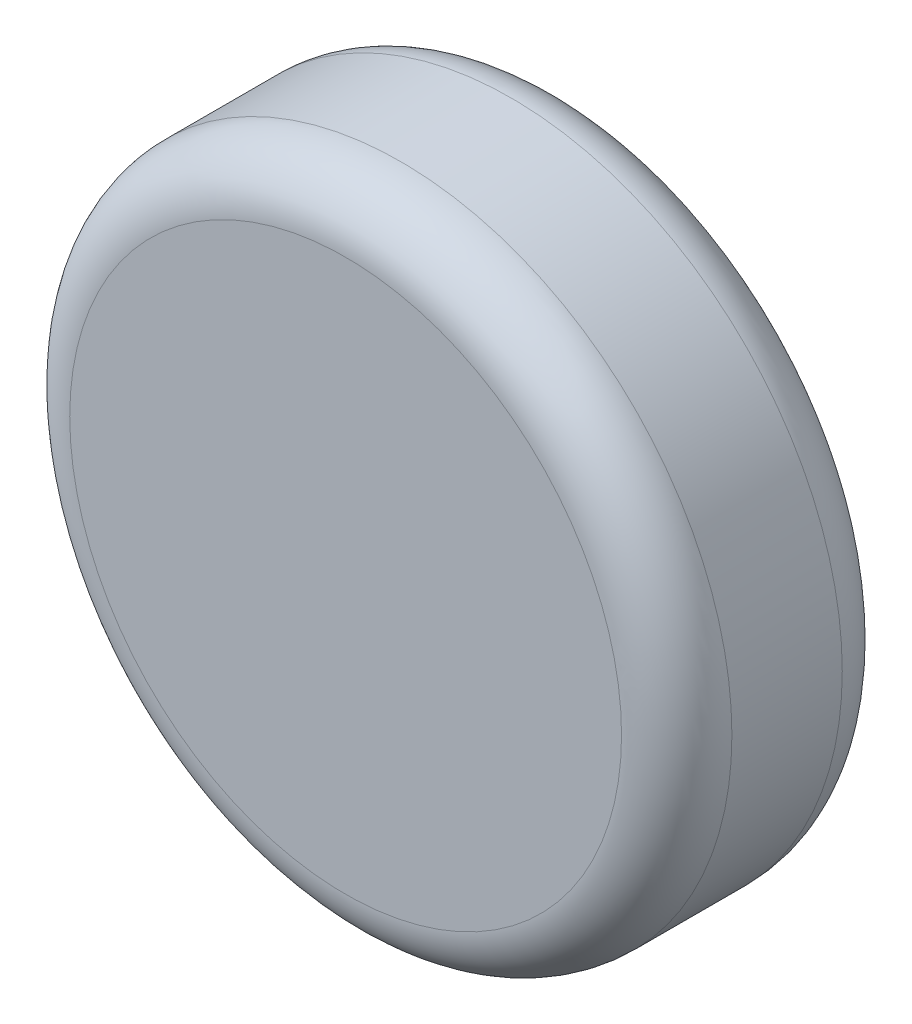
ISO-10303-21;
HEADER;
FILE_DESCRIPTION(('STEP AP214'),'2;1');
FILE_NAME('part.step','',(''),(''),'','','');
FILE_SCHEMA(('AUTOMOTIVE_DESIGN { 1 0 10303 214 1 1 1 1 }'));
ENDSEC;
DATA;
#1=APPLICATION_CONTEXT('core data for automotive mechanical design processes');
#2=APPLICATION_PROTOCOL_DEFINITION('international standard','automotive_design',2000,#1);
#3=PRODUCT_CONTEXT('',#1,'mechanical');
#4=PRODUCT('Part','Part','',(#3));
#5=PRODUCT_RELATED_PRODUCT_CATEGORY('part','',(#4));
#6=PRODUCT_DEFINITION_FORMATION('','',#4);
#7=PRODUCT_DEFINITION_CONTEXT('part definition',#1,'design');
#8=PRODUCT_DEFINITION('design','',#6,#7);
#9=PRODUCT_DEFINITION_SHAPE('','',#8);
#10=(LENGTH_UNIT() NAMED_UNIT(*) SI_UNIT(.MILLI.,.METRE.));
#11=(NAMED_UNIT(*) PLANE_ANGLE_UNIT() SI_UNIT($,.RADIAN.));
#12=(NAMED_UNIT(*) SI_UNIT($,.STERADIAN.) SOLID_ANGLE_UNIT());
#13=UNCERTAINTY_MEASURE_WITH_UNIT(LENGTH_MEASURE(1.E-05),#10,'distance_accuracy_value','');
#14=(GEOMETRIC_REPRESENTATION_CONTEXT(3) GLOBAL_UNCERTAINTY_ASSIGNED_CONTEXT((#13)) GLOBAL_UNIT_ASSIGNED_CONTEXT((#10,
#11,#12)) REPRESENTATION_CONTEXT('',''));
#15=CARTESIAN_POINT('',(0.,0.,0.));
#16=DIRECTION('',(0.,0.,1.));
#17=DIRECTION('',(1.,0.,0.));
#18=AXIS2_PLACEMENT_3D('',#15,#16,#17);
#19=CARTESIAN_POINT('',(0.,0.,50.8));
#20=DIRECTION('',(0.,0.,-1.));
#21=DIRECTION('',(-1.,0.,0.));
#22=AXIS2_PLACEMENT_3D('',#19,#20,#21);
#23=CYLINDRICAL_SURFACE('',#22,76.2);
#24=CARTESIAN_POINT('',(0.,0.,12.7));
#25=DIRECTION('',(0.,0.,1.));
#26=DIRECTION('',(1.,0.,0.));
#27=AXIS2_PLACEMENT_3D('',#24,#25,#26);
#28=CIRCLE('',#27,76.2);
#29=CARTESIAN_POINT('',(76.2,0.,12.7));
#30=VERTEX_POINT('',#29);
#31=EDGE_CURVE('E44',#30,#30,#28,.T.);
#32=ORIENTED_EDGE('',*,*,#31,.T.);
#33=EDGE_LOOP('',(#32));
#34=FACE_BOUND('',#33,.T.);
#35=CARTESIAN_POINT('',(0.,0.,38.1));
#36=DIRECTION('',(0.,0.,1.));
#37=DIRECTION('',(1.,0.,0.));
#38=AXIS2_PLACEMENT_3D('',#35,#36,#37);
#39=CIRCLE('',#38,76.2);
#40=CARTESIAN_POINT('',(76.2,0.,38.1));
#41=VERTEX_POINT('',#40);
#42=EDGE_CURVE('E48',#41,#41,#39,.F.);
#43=ORIENTED_EDGE('',*,*,#42,.T.);
#44=EDGE_LOOP('',(#43));
#45=FACE_BOUND('',#44,.T.);
#46=ADVANCED_FACE('F33',(#34,#45),#23,.T.);
#47=CARTESIAN_POINT('',(0.,0.,50.8));
#48=DIRECTION('',(0.,0.,1.));
#49=DIRECTION('',(1.,0.,0.));
#50=AXIS2_PLACEMENT_3D('',#47,#48,#49);
#51=PLANE('',#50);
#52=CARTESIAN_POINT('',(0.,0.,50.8));
#53=DIRECTION('',(0.,0.,1.));
#54=DIRECTION('',(1.,0.,0.));
#55=AXIS2_PLACEMENT_3D('',#52,#53,#54);
#56=CIRCLE('',#55,63.5);
#57=CARTESIAN_POINT('',(63.5,0.,50.8));
#58=VERTEX_POINT('',#57);
#59=EDGE_CURVE('E10',#58,#58,#56,.T.);
#60=ORIENTED_EDGE('',*,*,#59,.T.);
#61=EDGE_LOOP('',(#60));
#62=FACE_BOUND('',#61,.T.);
#63=ADVANCED_FACE('F64',(#62),#51,.T.);
#64=CARTESIAN_POINT('',(0.,0.,0.));
#65=DIRECTION('',(0.,0.,1.));
#66=DIRECTION('',(1.,0.,0.));
#67=AXIS2_PLACEMENT_3D('',#64,#65,#66);
#68=PLANE('',#67);
#69=CARTESIAN_POINT('',(0.,0.,0.));
#70=DIRECTION('',(0.,0.,1.));
#71=DIRECTION('',(1.,0.,0.));
#72=AXIS2_PLACEMENT_3D('',#69,#70,#71);
#73=CIRCLE('',#72,63.5);
#74=CARTESIAN_POINT('',(63.5,0.,0.));
#75=VERTEX_POINT('',#74);
#76=EDGE_CURVE('E40',#75,#75,#73,.F.);
#77=ORIENTED_EDGE('',*,*,#76,.T.);
#78=EDGE_LOOP('',(#77));
#79=FACE_BOUND('',#78,.T.);
#80=ADVANCED_FACE('F61',(#79),#68,.F.);
#81=CARTESIAN_POINT('',(0.,0.,12.7));
#82=DIRECTION('',(0.,0.,1.));
#83=DIRECTION('',(1.,0.,0.));
#84=AXIS2_PLACEMENT_3D('',#81,#82,#83);
#85=TOROIDAL_SURFACE('',#84,63.5,12.7);
#86=ORIENTED_EDGE('',*,*,#76,.F.);
#87=EDGE_LOOP('',(#86));
#88=FACE_BOUND('',#87,.T.);
#89=ORIENTED_EDGE('',*,*,#31,.F.);
#90=EDGE_LOOP('',(#89));
#91=FACE_BOUND('',#90,.T.);
#92=ADVANCED_FACE('F57',(#88,#91),#85,.T.);
#93=CARTESIAN_POINT('',(0.,0.,38.1));
#94=DIRECTION('',(0.,0.,1.));
#95=DIRECTION('',(1.,0.,0.));
#96=AXIS2_PLACEMENT_3D('',#93,#94,#95);
#97=TOROIDAL_SURFACE('',#96,63.5,12.7);
#98=ORIENTED_EDGE('',*,*,#42,.F.);
#99=EDGE_LOOP('',(#98));
#100=FACE_BOUND('',#99,.T.);
#101=ORIENTED_EDGE('',*,*,#59,.F.);
#102=EDGE_LOOP('',(#101));
#103=FACE_BOUND('',#102,.T.);
#104=ADVANCED_FACE('F35',(#100,#103),#97,.T.);
#105=CLOSED_SHELL('',(#46,#63,#80,#92,#104));
#106=MANIFOLD_SOLID_BREP('B2',#105);
#107=ADVANCED_BREP_SHAPE_REPRESENTATION('',(#18,#106),#14);
#108=SHAPE_DEFINITION_REPRESENTATION(#9,#107);
ENDSEC;
END-ISO-10303-21;
